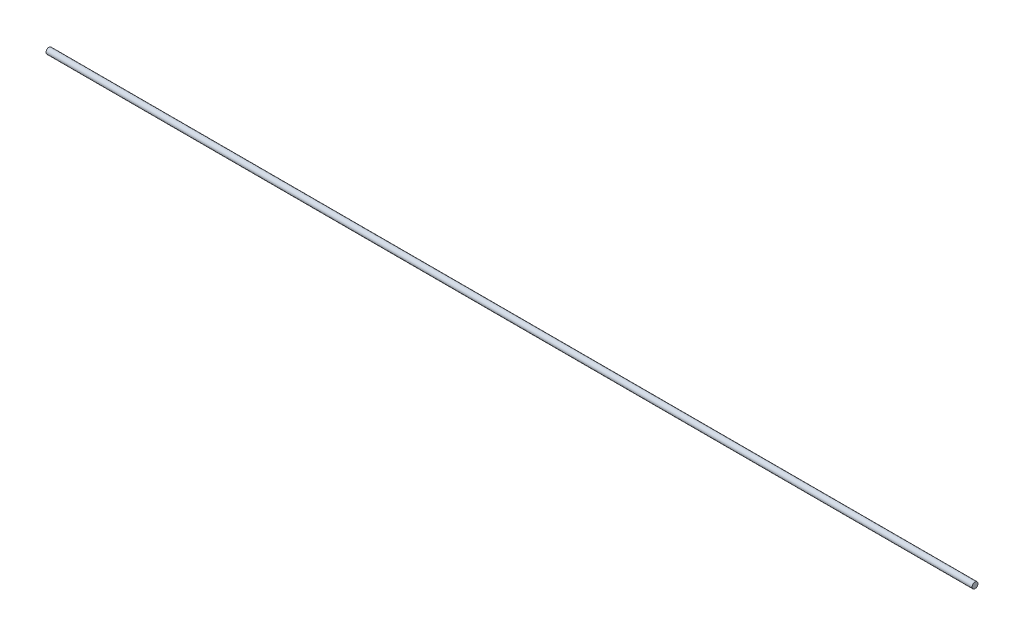
ISO-10303-21;
HEADER;
FILE_DESCRIPTION(('STEP AP214'),'2;1');
FILE_NAME('part.step','',(''),(''),'','','');
FILE_SCHEMA(('AUTOMOTIVE_DESIGN { 1 0 10303 214 1 1 1 1 }'));
ENDSEC;
DATA;
#1=APPLICATION_CONTEXT('core data for automotive mechanical design processes');
#2=APPLICATION_PROTOCOL_DEFINITION('international standard','automotive_design',2000,#1);
#3=PRODUCT_CONTEXT('',#1,'mechanical');
#4=PRODUCT('Part','Part','',(#3));
#5=PRODUCT_RELATED_PRODUCT_CATEGORY('part','',(#4));
#6=PRODUCT_DEFINITION_FORMATION('','',#4);
#7=PRODUCT_DEFINITION_CONTEXT('part definition',#1,'design');
#8=PRODUCT_DEFINITION('design','',#6,#7);
#9=PRODUCT_DEFINITION_SHAPE('','',#8);
#10=(LENGTH_UNIT() NAMED_UNIT(*) SI_UNIT(.MILLI.,.METRE.));
#11=(NAMED_UNIT(*) PLANE_ANGLE_UNIT() SI_UNIT($,.RADIAN.));
#12=(NAMED_UNIT(*) SI_UNIT($,.STERADIAN.) SOLID_ANGLE_UNIT());
#13=UNCERTAINTY_MEASURE_WITH_UNIT(LENGTH_MEASURE(1.E-05),#10,'distance_accuracy_value','');
#14=(GEOMETRIC_REPRESENTATION_CONTEXT(3) GLOBAL_UNCERTAINTY_ASSIGNED_CONTEXT((#13)) GLOBAL_UNIT_ASSIGNED_CONTEXT((#10,
#11,#12)) REPRESENTATION_CONTEXT('',''));
#15=CARTESIAN_POINT('',(0.,0.,0.));
#16=DIRECTION('',(0.,0.,1.));
#17=DIRECTION('',(1.,0.,0.));
#18=AXIS2_PLACEMENT_3D('',#15,#16,#17);
#19=CARTESIAN_POINT('',(499.999,0.,0.));
#20=DIRECTION('',(-1.,0.,0.));
#21=DIRECTION('',(0.,0.,1.));
#22=AXIS2_PLACEMENT_3D('',#19,#20,#21);
#23=CYLINDRICAL_SURFACE('',#22,1.5875);
#24=CARTESIAN_POINT('',(499.999,0.,0.));
#25=DIRECTION('',(1.,0.,0.));
#26=DIRECTION('',(0.,0.,-1.));
#27=AXIS2_PLACEMENT_3D('',#24,#25,#26);
#28=CIRCLE('',#27,1.5875);
#29=CARTESIAN_POINT('',(499.999,0.,1.5875));
#30=VERTEX_POINT('',#29);
#31=EDGE_CURVE('E10',#30,#30,#28,.T.);
#32=CARTESIAN_POINT('',(0.,0.,0.));
#33=DIRECTION('',(1.,0.,0.));
#34=DIRECTION('',(0.,0.,-1.));
#35=AXIS2_PLACEMENT_3D('',#32,#33,#34);
#36=CIRCLE('',#35,1.5875);
#37=CARTESIAN_POINT('',(0.,0.,1.5875));
#38=VERTEX_POINT('',#37);
#39=EDGE_CURVE('E44',#38,#38,#36,.T.);
#40=CARTESIAN_POINT('',(499.999,0.,1.5875));
#41=CARTESIAN_POINT('',(494.790677083333,0.,1.5875));
#42=CARTESIAN_POINT('',(489.582354166667,0.,1.5875));
#43=CARTESIAN_POINT('',(479.165708333333,0.,1.5875));
#44=CARTESIAN_POINT('',(473.957385416667,0.,1.5875));
#45=CARTESIAN_POINT('',(463.540739583333,0.,1.5875));
#46=CARTESIAN_POINT('',(458.332416666667,0.,1.5875));
#47=CARTESIAN_POINT('',(447.915770833333,0.,1.5875));
#48=CARTESIAN_POINT('',(442.707447916667,0.,1.5875));
#49=CARTESIAN_POINT('',(432.290802083333,0.,1.5875));
#50=CARTESIAN_POINT('',(427.082479166667,0.,1.5875));
#51=CARTESIAN_POINT('',(416.665833333333,0.,1.5875));
#52=CARTESIAN_POINT('',(411.457510416667,0.,1.5875));
#53=CARTESIAN_POINT('',(401.040864583333,0.,1.5875));
#54=CARTESIAN_POINT('',(395.832541666667,0.,1.5875));
#55=CARTESIAN_POINT('',(385.415895833333,0.,1.5875));
#56=CARTESIAN_POINT('',(380.207572916667,0.,1.5875));
#57=CARTESIAN_POINT('',(369.790927083333,0.,1.5875));
#58=CARTESIAN_POINT('',(364.582604166667,0.,1.5875));
#59=CARTESIAN_POINT('',(354.165958333333,0.,1.5875));
#60=CARTESIAN_POINT('',(348.957635416667,0.,1.5875));
#61=CARTESIAN_POINT('',(338.540989583333,0.,1.5875));
#62=CARTESIAN_POINT('',(333.332666666667,0.,1.5875));
#63=CARTESIAN_POINT('',(322.916020833333,0.,1.5875));
#64=CARTESIAN_POINT('',(317.707697916667,0.,1.5875));
#65=CARTESIAN_POINT('',(307.291052083333,0.,1.5875));
#66=CARTESIAN_POINT('',(302.082729166667,0.,1.5875));
#67=CARTESIAN_POINT('',(291.666083333333,0.,1.5875));
#68=CARTESIAN_POINT('',(286.457760416667,0.,1.5875));
#69=CARTESIAN_POINT('',(276.041114583333,0.,1.5875));
#70=CARTESIAN_POINT('',(270.832791666667,0.,1.5875));
#71=CARTESIAN_POINT('',(260.416145833333,0.,1.5875));
#72=CARTESIAN_POINT('',(255.207822916667,0.,1.5875));
#73=CARTESIAN_POINT('',(244.791177083333,0.,1.5875));
#74=CARTESIAN_POINT('',(239.582854166667,0.,1.5875));
#75=CARTESIAN_POINT('',(229.166208333333,0.,1.5875));
#76=CARTESIAN_POINT('',(223.957885416667,0.,1.5875));
#77=CARTESIAN_POINT('',(213.541239583333,0.,1.5875));
#78=CARTESIAN_POINT('',(208.332916666667,0.,1.5875));
#79=CARTESIAN_POINT('',(197.916270833333,0.,1.5875));
#80=CARTESIAN_POINT('',(192.707947916667,0.,1.5875));
#81=CARTESIAN_POINT('',(182.291302083333,0.,1.5875));
#82=CARTESIAN_POINT('',(177.082979166667,0.,1.5875));
#83=CARTESIAN_POINT('',(166.666333333333,0.,1.5875));
#84=CARTESIAN_POINT('',(161.458010416667,0.,1.5875));
#85=CARTESIAN_POINT('',(151.041364583333,0.,1.5875));
#86=CARTESIAN_POINT('',(145.833041666667,0.,1.5875));
#87=CARTESIAN_POINT('',(135.416395833333,0.,1.5875));
#88=CARTESIAN_POINT('',(130.208072916667,0.,1.5875));
#89=CARTESIAN_POINT('',(119.791427083333,0.,1.5875));
#90=CARTESIAN_POINT('',(114.583104166667,0.,1.5875));
#91=CARTESIAN_POINT('',(104.166458333333,0.,1.5875));
#92=CARTESIAN_POINT('',(98.9581354166666,0.,1.5875));
#93=CARTESIAN_POINT('',(88.5414895833333,0.,1.5875));
#94=CARTESIAN_POINT('',(83.3331666666666,0.,1.5875));
#95=CARTESIAN_POINT('',(72.9165208333333,0.,1.5875));
#96=CARTESIAN_POINT('',(67.7081979166666,0.,1.5875));
#97=CARTESIAN_POINT('',(57.2915520833333,0.,1.5875));
#98=CARTESIAN_POINT('',(52.0832291666666,0.,1.5875));
#99=CARTESIAN_POINT('',(41.6665833333333,0.,1.5875));
#100=CARTESIAN_POINT('',(36.4582604166666,0.,1.5875));
#101=CARTESIAN_POINT('',(26.0416145833333,0.,1.5875));
#102=CARTESIAN_POINT('',(20.8332916666666,0.,1.5875));
#103=CARTESIAN_POINT('',(10.4166458333333,0.,1.5875));
#104=CARTESIAN_POINT('',(5.20832291666661,0.,1.5875));
#105=CARTESIAN_POINT('',(0.,0.,1.5875));
#106=B_SPLINE_CURVE_WITH_KNOTS('',3,(#40,#41,#42,#43,#44,#45,#46,#47,#48,#49,#50,#51,#52,#53,
#54,#55,#56,#57,#58,#59,#60,#61,#62,#63,#64,#65,#66,#67,#68,#69,#70,#71,#72,#73,#74,#75,#76,#77,
#78,#79,#80,#81,#82,#83,#84,#85,#86,#87,#88,#89,#90,#91,#92,#93,#94,#95,#96,#97,#98,#99,#100,
#101,#102,#103,#104,#105),.UNSPECIFIED.,.F.,.F.,(4,2,2,2,2,2,2,2,2,2,2,2,2,2,2,2,2,2,2,2,2,2,2,
2,2,2,2,2,2,2,2,2,4),(0.,15.62496875,31.2499375,46.87490625,62.499875,78.12484375,93.7498125,
109.37478125,124.99975,140.62471875,156.2496875,171.87465625,187.499625,203.12459375,
218.7495625,234.37453125,249.9995,265.62446875,281.2494375,296.87440625,312.499375,328.12434375,
343.7493125,359.37428125,374.99925,390.62421875,406.2491875,421.87415625,437.499125,
453.12409375,468.7490625,484.37403125,499.999),.UNSPECIFIED.);
#107=EDGE_CURVE('BSEAM41',#30,#38,#106,.T.);
#108=ORIENTED_EDGE('',*,*,#31,.F.);
#109=ORIENTED_EDGE('',*,*,#39,.T.);
#110=ORIENTED_EDGE('',*,*,#107,.T.);
#111=ORIENTED_EDGE('',*,*,#107,.F.);
#112=EDGE_LOOP('',(#108,#110,#109,#111));
#113=FACE_BOUND('',#112,.T.);
#114=ADVANCED_FACE('F41',(#113),#23,.T.);
#115=CARTESIAN_POINT('',(499.999,0.,0.));
#116=DIRECTION('',(1.,0.,0.));
#117=DIRECTION('',(0.,0.,-1.));
#118=AXIS2_PLACEMENT_3D('',#115,#116,#117);
#119=PLANE('',#118);
#120=ORIENTED_EDGE('',*,*,#31,.T.);
#121=EDGE_LOOP('',(#120));
#122=FACE_BOUND('',#121,.T.);
#123=ADVANCED_FACE('F58',(#122),#119,.T.);
#124=CARTESIAN_POINT('',(0.,0.,0.));
#125=DIRECTION('',(1.,0.,0.));
#126=DIRECTION('',(0.,0.,-1.));
#127=AXIS2_PLACEMENT_3D('',#124,#125,#126);
#128=PLANE('',#127);
#129=ORIENTED_EDGE('',*,*,#39,.F.);
#130=EDGE_LOOP('',(#129));
#131=FACE_BOUND('',#130,.T.);
#132=ADVANCED_FACE('F56',(#131),#128,.F.);
#133=CLOSED_SHELL('',(#114,#123,#132));
#134=MANIFOLD_SOLID_BREP('B2',#133);
#135=ADVANCED_BREP_SHAPE_REPRESENTATION('',(#18,#134),#14);
#136=SHAPE_DEFINITION_REPRESENTATION(#9,#135);
ENDSEC;
END-ISO-10303-21;
